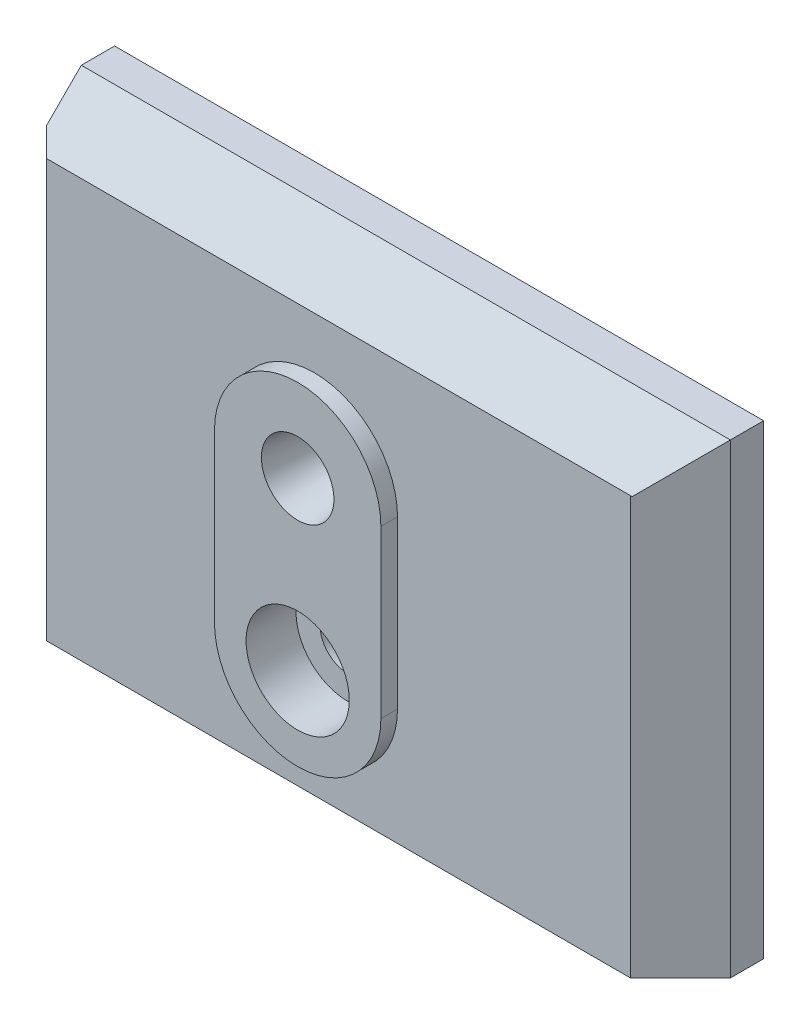
ISO-10303-21;
HEADER;
FILE_DESCRIPTION(('STEP AP214'),'2;1');
FILE_NAME('part.step','',(''),(''),'','','');
FILE_SCHEMA(('AUTOMOTIVE_DESIGN { 1 0 10303 214 1 1 1 1 }'));
ENDSEC;
DATA;
#1=APPLICATION_CONTEXT('core data for automotive mechanical design processes');
#2=APPLICATION_PROTOCOL_DEFINITION('international standard','automotive_design',2000,#1);
#3=PRODUCT_CONTEXT('',#1,'mechanical');
#4=PRODUCT('Part','Part','',(#3));
#5=PRODUCT_RELATED_PRODUCT_CATEGORY('part','',(#4));
#6=PRODUCT_DEFINITION_FORMATION('','',#4);
#7=PRODUCT_DEFINITION_CONTEXT('part definition',#1,'design');
#8=PRODUCT_DEFINITION('design','',#6,#7);
#9=PRODUCT_DEFINITION_SHAPE('','',#8);
#10=(LENGTH_UNIT() NAMED_UNIT(*) SI_UNIT(.MILLI.,.METRE.));
#11=(NAMED_UNIT(*) PLANE_ANGLE_UNIT() SI_UNIT($,.RADIAN.));
#12=(NAMED_UNIT(*) SI_UNIT($,.STERADIAN.) SOLID_ANGLE_UNIT());
#13=UNCERTAINTY_MEASURE_WITH_UNIT(LENGTH_MEASURE(1.E-05),#10,'distance_accuracy_value','');
#14=(GEOMETRIC_REPRESENTATION_CONTEXT(3) GLOBAL_UNCERTAINTY_ASSIGNED_CONTEXT((#13)) GLOBAL_UNIT_ASSIGNED_CONTEXT((#10,
#11,#12)) REPRESENTATION_CONTEXT('',''));
#15=CARTESIAN_POINT('',(0.,0.,0.));
#16=DIRECTION('',(0.,0.,1.));
#17=DIRECTION('',(1.,0.,0.));
#18=AXIS2_PLACEMENT_3D('',#15,#16,#17);
#19=CARTESIAN_POINT('',(0.,-10.,3.));
#20=DIRECTION('',(0.,0.,1.));
#21=DIRECTION('',(1.,0.,0.));
#22=AXIS2_PLACEMENT_3D('',#19,#20,#21);
#23=CYLINDRICAL_SURFACE('',#22,3.1);
#24=CARTESIAN_POINT('',(0.,-10.,3.));
#25=DIRECTION('',(0.,0.,1.));
#26=DIRECTION('',(1.,0.,0.));
#27=AXIS2_PLACEMENT_3D('',#24,#25,#26);
#28=CIRCLE('',#27,3.1);
#29=CARTESIAN_POINT('',(3.1,-10.,3.));
#30=VERTEX_POINT('',#29);
#31=EDGE_CURVE('E189',#30,#30,#28,.T.);
#32=ORIENTED_EDGE('',*,*,#31,.F.);
#33=EDGE_LOOP('',(#32));
#34=FACE_BOUND('',#33,.T.);
#35=CARTESIAN_POINT('',(0.,-10.,6.));
#36=DIRECTION('',(0.,0.,1.));
#37=DIRECTION('',(1.,0.,0.));
#38=AXIS2_PLACEMENT_3D('',#35,#36,#37);
#39=CIRCLE('',#38,3.1);
#40=CARTESIAN_POINT('',(3.1,-10.,6.));
#41=VERTEX_POINT('',#40);
#42=EDGE_CURVE('E19',#41,#41,#39,.F.);
#43=ORIENTED_EDGE('',*,*,#42,.F.);
#44=EDGE_LOOP('',(#43));
#45=FACE_BOUND('',#44,.T.);
#46=ADVANCED_FACE('F16',(#34,#45),#23,.F.);
#47=CARTESIAN_POINT('',(-20.,8.050252531694,4.949747468306));
#48=DIRECTION('',(0.,-0.707106781186548,0.707106781186548));
#49=DIRECTION('',(0.,-0.707106781186548,-0.707106781186548));
#50=AXIS2_PLACEMENT_3D('',#47,#48,#49);
#51=PLANE('',#50);
#52=DIRECTION('',(1.,0.,0.));
#53=VECTOR('',#52,1.);
#54=CARTESIAN_POINT('',(-20.,8.050252531694,4.949747468306));
#55=LINE('',#54,#53);
#56=CARTESIAN_POINT('',(-16.1507575950797,8.050252531694,4.94974746830575));
#57=VERTEX_POINT('',#56);
#58=CARTESIAN_POINT('',(19.050252531694,8.050252531694,4.949747468306));
#59=VERTEX_POINT('',#58);
#60=EDGE_CURVE('E192',#57,#59,#55,.T.);
#61=ORIENTED_EDGE('',*,*,#60,.F.);
#62=DIRECTION('',(0.577350269201096,0.577350269166656,0.577350269201125));
#63=VECTOR('',#62,1.);
#64=CARTESIAN_POINT('',(-16.150757595079,8.05025253169402,4.949747468305));
#65=LINE('',#64,#63);
#66=CARTESIAN_POINT('',(-16.1005050633805,8.10050506338801,5.0000000000005));
#67=VERTEX_POINT('',#66);
#68=EDGE_CURVE('E204',#57,#67,#65,.T.);
#69=ORIENTED_EDGE('',*,*,#68,.T.);
#70=DIRECTION('',(1.,0.,0.));
#71=VECTOR('',#70,1.);
#72=CARTESIAN_POINT('',(-17.,8.100505063388,5.));
#73=LINE('',#72,#71);
#74=CARTESIAN_POINT('',(19.,8.10050506338801,5.));
#75=VERTEX_POINT('',#74);
#76=EDGE_CURVE('E211',#75,#67,#73,.F.);
#77=ORIENTED_EDGE('',*,*,#76,.F.);
#78=DIRECTION('',(-0.577350269189639,0.577350269189619,0.577350269189619));
#79=VECTOR('',#78,1.);
#80=CARTESIAN_POINT('',(19.050252531694,8.050252531694,4.949747468306));
#81=LINE('',#80,#79);
#82=EDGE_CURVE('E168',#59,#75,#81,.T.);
#83=ORIENTED_EDGE('',*,*,#82,.F.);
#84=EDGE_LOOP('',(#61,#69,#77,#83));
#85=FACE_BOUND('',#84,.T.);
#86=ADVANCED_FACE('F354',(#85),#51,.F.);
#87=CARTESIAN_POINT('',(5.,-10.,0.));
#88=DIRECTION('',(1.,0.,0.));
#89=DIRECTION('',(0.,0.,-1.));
#90=AXIS2_PLACEMENT_3D('',#87,#88,#89);
#91=PLANE('',#90);
#92=DIRECTION('',(0.,0.,1.));
#93=VECTOR('',#92,1.);
#94=CARTESIAN_POINT('',(5.,0.,5.));
#95=LINE('',#94,#93);
#96=CARTESIAN_POINT('',(5.,0.,6.));
#97=VERTEX_POINT('',#96);
#98=CARTESIAN_POINT('',(5.,0.,5.));
#99=VERTEX_POINT('',#98);
#100=EDGE_CURVE('E162',#97,#99,#95,.F.);
#101=ORIENTED_EDGE('',*,*,#100,.F.);
#102=DIRECTION('',(0.,1.,0.));
#103=VECTOR('',#102,1.);
#104=CARTESIAN_POINT('',(5.,-10.,6.));
#105=LINE('',#104,#103);
#106=CARTESIAN_POINT('',(5.,-10.,6.));
#107=VERTEX_POINT('',#106);
#108=EDGE_CURVE('E135',#97,#107,#105,.F.);
#109=ORIENTED_EDGE('',*,*,#108,.T.);
#110=DIRECTION('',(0.,0.,1.));
#111=VECTOR('',#110,1.);
#112=CARTESIAN_POINT('',(5.,-10.,5.));
#113=LINE('',#112,#111);
#114=CARTESIAN_POINT('',(5.,-10.,5.));
#115=VERTEX_POINT('',#114);
#116=EDGE_CURVE('E147',#115,#107,#113,.T.);
#117=ORIENTED_EDGE('',*,*,#116,.F.);
#118=DIRECTION('',(0.,1.,0.));
#119=VECTOR('',#118,1.);
#120=CARTESIAN_POINT('',(5.,-17.,5.));
#121=LINE('',#120,#119);
#122=EDGE_CURVE('E188',#99,#115,#121,.F.);
#123=ORIENTED_EDGE('',*,*,#122,.F.);
#124=EDGE_LOOP('',(#101,#109,#117,#123));
#125=FACE_BOUND('',#124,.T.);
#126=ADVANCED_FACE('F365',(#125),#91,.T.);
#127=CARTESIAN_POINT('',(0.,-10.,5.));
#128=DIRECTION('',(0.,0.,1.));
#129=DIRECTION('',(1.,0.,0.));
#130=AXIS2_PLACEMENT_3D('',#127,#128,#129);
#131=CYLINDRICAL_SURFACE('',#130,5.);
#132=CARTESIAN_POINT('',(0.,-10.,6.));
#133=DIRECTION('',(0.,0.,1.));
#134=DIRECTION('',(1.,0.,0.));
#135=AXIS2_PLACEMENT_3D('',#132,#133,#134);
#136=CIRCLE('',#135,5.);
#137=CARTESIAN_POINT('',(-5.,-10.,6.));
#138=VERTEX_POINT('',#137);
#139=EDGE_CURVE('E141',#107,#138,#136,.F.);
#140=ORIENTED_EDGE('',*,*,#139,.T.);
#141=DIRECTION('',(0.,0.,-1.));
#142=VECTOR('',#141,1.);
#143=CARTESIAN_POINT('',(-5.,-10.,0.));
#144=LINE('',#143,#142);
#145=CARTESIAN_POINT('',(-5.,-10.,5.));
#146=VERTEX_POINT('',#145);
#147=EDGE_CURVE('E145',#138,#146,#144,.T.);
#148=ORIENTED_EDGE('',*,*,#147,.T.);
#149=CARTESIAN_POINT('',(0.,-10.,5.));
#150=DIRECTION('',(0.,0.,1.));
#151=DIRECTION('',(1.,0.,0.));
#152=AXIS2_PLACEMENT_3D('',#149,#150,#151);
#153=CIRCLE('',#152,5.);
#154=EDGE_CURVE('E186',#115,#146,#153,.F.);
#155=ORIENTED_EDGE('',*,*,#154,.F.);
#156=ORIENTED_EDGE('',*,*,#116,.T.);
#157=EDGE_LOOP('',(#140,#148,#155,#156));
#158=FACE_BOUND('',#157,.T.);
#159=ADVANCED_FACE('F143',(#158),#131,.T.);
#160=CARTESIAN_POINT('',(-5.,-10.,0.));
#161=DIRECTION('',(1.,0.,0.));
#162=DIRECTION('',(0.,0.,-1.));
#163=AXIS2_PLACEMENT_3D('',#160,#161,#162);
#164=PLANE('',#163);
#165=DIRECTION('',(0.,0.,1.));
#166=VECTOR('',#165,1.);
#167=CARTESIAN_POINT('',(-5.,0.,5.));
#168=LINE('',#167,#166);
#169=CARTESIAN_POINT('',(-5.,0.,5.));
#170=VERTEX_POINT('',#169);
#171=CARTESIAN_POINT('',(-5.,0.,6.));
#172=VERTEX_POINT('',#171);
#173=EDGE_CURVE('E164',#170,#172,#168,.T.);
#174=ORIENTED_EDGE('',*,*,#173,.F.);
#175=DIRECTION('',(0.,1.,0.));
#176=VECTOR('',#175,1.);
#177=CARTESIAN_POINT('',(-5.,-17.,5.));
#178=LINE('',#177,#176);
#179=EDGE_CURVE('E155',#146,#170,#178,.T.);
#180=ORIENTED_EDGE('',*,*,#179,.F.);
#181=ORIENTED_EDGE('',*,*,#147,.F.);
#182=DIRECTION('',(0.,1.,0.));
#183=VECTOR('',#182,1.);
#184=CARTESIAN_POINT('',(-5.,-10.,6.));
#185=LINE('',#184,#183);
#186=EDGE_CURVE('E153',#172,#138,#185,.F.);
#187=ORIENTED_EDGE('',*,*,#186,.F.);
#188=EDGE_LOOP('',(#174,#180,#181,#187));
#189=FACE_BOUND('',#188,.T.);
#190=ADVANCED_FACE('F152',(#189),#164,.F.);
#191=CARTESIAN_POINT('',(0.,0.,5.));
#192=DIRECTION('',(0.,0.,1.));
#193=DIRECTION('',(1.,0.,0.));
#194=AXIS2_PLACEMENT_3D('',#191,#192,#193);
#195=CYLINDRICAL_SURFACE('',#194,5.);
#196=CARTESIAN_POINT('',(0.,0.,5.));
#197=DIRECTION('',(0.,0.,1.));
#198=DIRECTION('',(1.,0.,0.));
#199=AXIS2_PLACEMENT_3D('',#196,#197,#198);
#200=CIRCLE('',#199,5.);
#201=EDGE_CURVE('E182',#170,#99,#200,.F.);
#202=ORIENTED_EDGE('',*,*,#201,.F.);
#203=ORIENTED_EDGE('',*,*,#173,.T.);
#204=CARTESIAN_POINT('',(0.,0.,6.));
#205=DIRECTION('',(0.,0.,1.));
#206=DIRECTION('',(1.,0.,0.));
#207=AXIS2_PLACEMENT_3D('',#204,#205,#206);
#208=CIRCLE('',#207,5.);
#209=EDGE_CURVE('E161',#97,#172,#208,.T.);
#210=ORIENTED_EDGE('',*,*,#209,.F.);
#211=ORIENTED_EDGE('',*,*,#100,.T.);
#212=EDGE_LOOP('',(#202,#203,#210,#211));
#213=FACE_BOUND('',#212,.T.);
#214=ADVANCED_FACE('F432',(#213),#195,.T.);
#215=CARTESIAN_POINT('',(0.,0.,6.));
#216=DIRECTION('',(0.,0.,1.));
#217=DIRECTION('',(1.,0.,0.));
#218=AXIS2_PLACEMENT_3D('',#215,#216,#217);
#219=PLANE('',#218);
#220=ORIENTED_EDGE('',*,*,#186,.T.);
#221=ORIENTED_EDGE('',*,*,#139,.F.);
#222=ORIENTED_EDGE('',*,*,#108,.F.);
#223=ORIENTED_EDGE('',*,*,#209,.T.);
#224=EDGE_LOOP('',(#220,#221,#222,#223));
#225=FACE_BOUND('',#224,.T.);
#226=ORIENTED_EDGE('',*,*,#42,.T.);
#227=EDGE_LOOP('',(#226));
#228=FACE_BOUND('',#227,.T.);
#229=CARTESIAN_POINT('',(0.,0.,6.00000000002865));
#230=DIRECTION('',(0.,0.,1.));
#231=DIRECTION('',(0.,-1.,0.));
#232=AXIS2_PLACEMENT_3D('',#229,#230,#231);
#233=CIRCLE('',#232,2.17999999999734);
#234=CARTESIAN_POINT('',(0.,-2.17999999999734,6.00000000002865));
#235=VERTEX_POINT('',#234);
#236=EDGE_CURVE('E178',#235,#235,#233,.F.);
#237=ORIENTED_EDGE('',*,*,#236,.T.);
#238=EDGE_LOOP('',(#237));
#239=FACE_BOUND('',#238,.T.);
#240=ADVANCED_FACE('F158',(#225,#228,#239),#219,.T.);
#241=CARTESIAN_POINT('',(0.,-10.,3.));
#242=DIRECTION('',(0.,0.,1.));
#243=DIRECTION('',(1.,0.,0.));
#244=AXIS2_PLACEMENT_3D('',#241,#242,#243);
#245=PLANE('',#244);
#246=CARTESIAN_POINT('',(0.,-10.,3.));
#247=DIRECTION('',(0.,0.,1.));
#248=DIRECTION('',(1.,0.,0.));
#249=AXIS2_PLACEMENT_3D('',#246,#247,#248);
#250=CIRCLE('',#249,1.65);
#251=CARTESIAN_POINT('',(1.65,-10.,3.));
#252=VERTEX_POINT('',#251);
#253=EDGE_CURVE('E174',#252,#252,#250,.F.);
#254=ORIENTED_EDGE('',*,*,#253,.T.);
#255=EDGE_LOOP('',(#254));
#256=FACE_BOUND('',#255,.T.);
#257=ORIENTED_EDGE('',*,*,#31,.T.);
#258=EDGE_LOOP('',(#257));
#259=FACE_BOUND('',#258,.T.);
#260=ADVANCED_FACE('F426',(#256,#259),#245,.T.);
#261=CARTESIAN_POINT('',(-20.,13.,0.));
#262=DIRECTION('',(0.,0.707106781186548,0.707106781186548));
#263=DIRECTION('',(0.,-0.707106781186548,0.707106781186548));
#264=AXIS2_PLACEMENT_3D('',#261,#262,#263);
#265=PLANE('',#264);
#266=DIRECTION('',(1.,0.,0.));
#267=VECTOR('',#266,1.);
#268=CARTESIAN_POINT('',(-17.,11.,2.));
#269=LINE('',#268,#267);
#270=CARTESIAN_POINT('',(-17.,11.,2.));
#271=VERTEX_POINT('',#270);
#272=CARTESIAN_POINT('',(22.,11.,2.));
#273=VERTEX_POINT('',#272);
#274=EDGE_CURVE('E177',#271,#273,#269,.T.);
#275=ORIENTED_EDGE('',*,*,#274,.F.);
#276=DIRECTION('',(0.,-0.707106781186548,0.707106781186547));
#277=VECTOR('',#276,1.);
#278=CARTESIAN_POINT('',(-17.,11.,2.));
#279=LINE('',#278,#277);
#280=CARTESIAN_POINT('',(-16.9999999999995,8.899494936612,4.1005050633875));
#281=VERTEX_POINT('',#280);
#282=EDGE_CURVE('E230',#271,#281,#279,.T.);
#283=ORIENTED_EDGE('',*,*,#282,.T.);
#284=DIRECTION('',(0.577350269189854,-0.57735026918917,0.577350269189853));
#285=VECTOR('',#284,1.);
#286=CARTESIAN_POINT('',(-16.999999999998,8.89949493661201,4.100505063386));
#287=LINE('',#286,#285);
#288=EDGE_CURVE('E201',#281,#57,#287,.T.);
#289=ORIENTED_EDGE('',*,*,#288,.T.);
#290=ORIENTED_EDGE('',*,*,#60,.T.);
#291=DIRECTION('',(-0.577350269189626,-0.577350269189625,0.577350269189626));
#292=VECTOR('',#291,1.);
#293=CARTESIAN_POINT('',(22.,11.,2.));
#294=LINE('',#293,#292);
#295=EDGE_CURVE('E181',#273,#59,#294,.T.);
#296=ORIENTED_EDGE('',*,*,#295,.F.);
#297=EDGE_LOOP('',(#275,#283,#289,#290,#296));
#298=FACE_BOUND('',#297,.T.);
#299=ADVANCED_FACE('F342',(#298),#265,.T.);
#300=CARTESIAN_POINT('',(-20.05025253169,-18.,1.050252531694));
#301=DIRECTION('',(0.707106781186548,0.,-0.707106781186548));
#302=DIRECTION('',(-0.707106781186548,0.,-0.707106781186548));
#303=AXIS2_PLACEMENT_3D('',#300,#301,#302);
#304=PLANE('',#303);
#305=ORIENTED_EDGE('',*,*,#288,.F.);
#306=DIRECTION('',(0.,1.,0.));
#307=VECTOR('',#306,1.);
#308=CARTESIAN_POINT('',(-17.,-17.,4.100505063388));
#309=LINE('',#308,#307);
#310=CARTESIAN_POINT('',(-16.999999999999,-17.,4.100505063387));
#311=VERTEX_POINT('',#310);
#312=EDGE_CURVE('E233',#281,#311,#309,.F.);
#313=ORIENTED_EDGE('',*,*,#312,.T.);
#314=DIRECTION('',(-0.707106781186548,0.,-0.707106781186548));
#315=VECTOR('',#314,1.);
#316=CARTESIAN_POINT('',(-20.05025253169,-17.,1.050252531694));
#317=LINE('',#316,#315);
#318=CARTESIAN_POINT('',(-16.100505063381,-17.,5.000000000001));
#319=VERTEX_POINT('',#318);
#320=EDGE_CURVE('E199',#319,#311,#317,.T.);
#321=ORIENTED_EDGE('',*,*,#320,.F.);
#322=DIRECTION('',(0.,1.,0.));
#323=VECTOR('',#322,1.);
#324=CARTESIAN_POINT('',(-16.10050506338,-17.,5.));
#325=LINE('',#324,#323);
#326=EDGE_CURVE('E213',#67,#319,#325,.F.);
#327=ORIENTED_EDGE('',*,*,#326,.F.);
#328=ORIENTED_EDGE('',*,*,#68,.F.);
#329=EDGE_LOOP('',(#305,#313,#321,#327,#328));
#330=FACE_BOUND('',#329,.T.);
#331=ADVANCED_FACE('F352',(#330),#304,.F.);
#332=CARTESIAN_POINT('',(15.,-18.,3.5));
#333=DIRECTION('',(0.707106781186548,0.,0.707106781186548));
#334=DIRECTION('',(0.707106781186548,0.,-0.707106781186548));
#335=AXIS2_PLACEMENT_3D('',#332,#333,#334);
#336=PLANE('',#335);
#337=DIRECTION('',(-0.707106781186548,0.,0.707106781186547));
#338=VECTOR('',#337,1.);
#339=CARTESIAN_POINT('',(17.5,-17.,1.));
#340=LINE('',#339,#338);
#341=CARTESIAN_POINT('',(17.5,-17.,1.));
#342=VERTEX_POINT('',#341);
#343=CARTESIAN_POINT('',(15.5,-17.,3.));
#344=VERTEX_POINT('',#343);
#345=EDGE_CURVE('E258',#342,#344,#340,.T.);
#346=ORIENTED_EDGE('',*,*,#345,.T.);
#347=DIRECTION('',(0.,1.,0.));
#348=VECTOR('',#347,1.);
#349=CARTESIAN_POINT('',(15.5,-18.,3.));
#350=LINE('',#349,#348);
#351=CARTESIAN_POINT('',(15.5,5.,3.));
#352=VERTEX_POINT('',#351);
#353=EDGE_CURVE('E207',#344,#352,#350,.T.);
#354=ORIENTED_EDGE('',*,*,#353,.T.);
#355=DIRECTION('',(0.707106781186548,0.,-0.707106781186547));
#356=VECTOR('',#355,1.);
#357=CARTESIAN_POINT('',(15.5,5.,3.));
#358=LINE('',#357,#356);
#359=CARTESIAN_POINT('',(17.5,5.00000000000001,0.999999999999999));
#360=VERTEX_POINT('',#359);
#361=EDGE_CURVE('E247',#352,#360,#358,.T.);
#362=ORIENTED_EDGE('',*,*,#361,.T.);
#363=DIRECTION('',(0.,1.,0.));
#364=VECTOR('',#363,1.);
#365=CARTESIAN_POINT('',(17.5,-18.,1.));
#366=LINE('',#365,#364);
#367=EDGE_CURVE('E250',#360,#342,#366,.F.);
#368=ORIENTED_EDGE('',*,*,#367,.T.);
#369=EDGE_LOOP('',(#346,#354,#362,#368));
#370=FACE_BOUND('',#369,.T.);
#371=ADVANCED_FACE('F417',(#370),#336,.F.);
#372=CARTESIAN_POINT('',(7.5,-18.,3.));
#373=DIRECTION('',(0.,0.,1.));
#374=DIRECTION('',(1.,0.,0.));
#375=AXIS2_PLACEMENT_3D('',#372,#373,#374);
#376=PLANE('',#375);
#377=DIRECTION('',(1.,0.,0.));
#378=VECTOR('',#377,1.);
#379=CARTESIAN_POINT('',(-17.,-17.,3.));
#380=LINE('',#379,#378);
#381=CARTESIAN_POINT('',(9.57106781186509,-17.,2.99999999999991));
#382=VERTEX_POINT('',#381);
#383=EDGE_CURVE('E261',#344,#382,#380,.F.);
#384=ORIENTED_EDGE('',*,*,#383,.T.);
#385=DIRECTION('',(0.,1.,0.));
#386=VECTOR('',#385,1.);
#387=CARTESIAN_POINT('',(9.57106781186537,-18.,2.99999999999963));
#388=LINE('',#387,#386);
#389=CARTESIAN_POINT('',(9.57106781186519,5.00000000000001,2.99999999999982));
#390=VERTEX_POINT('',#389);
#391=EDGE_CURVE('E209',#390,#382,#388,.F.);
#392=ORIENTED_EDGE('',*,*,#391,.F.);
#393=DIRECTION('',(1.,0.,0.));
#394=VECTOR('',#393,1.);
#395=CARTESIAN_POINT('',(7.5,5.,3.));
#396=LINE('',#395,#394);
#397=EDGE_CURVE('E244',#390,#352,#396,.T.);
#398=ORIENTED_EDGE('',*,*,#397,.T.);
#399=ORIENTED_EDGE('',*,*,#353,.F.);
#400=EDGE_LOOP('',(#384,#392,#398,#399));
#401=FACE_BOUND('',#400,.T.);
#402=ADVANCED_FACE('F413',(#401),#376,.F.);
#403=CARTESIAN_POINT('',(6.535533905933,-18.,-0.03553390593274));
#404=DIRECTION('',(0.707106781186548,0.,-0.707106781186548));
#405=DIRECTION('',(-0.707106781186548,0.,-0.707106781186548));
#406=AXIS2_PLACEMENT_3D('',#403,#404,#405);
#407=PLANE('',#406);
#408=DIRECTION('',(0.707106781186547,0.,0.707106781186547));
#409=VECTOR('',#408,1.);
#410=CARTESIAN_POINT('',(7.5,5.,0.928932188135));
#411=LINE('',#410,#409);
#412=CARTESIAN_POINT('',(7.50000000000009,5.,0.928932188134908));
#413=VERTEX_POINT('',#412);
#414=EDGE_CURVE('E241',#413,#390,#411,.T.);
#415=ORIENTED_EDGE('',*,*,#414,.T.);
#416=ORIENTED_EDGE('',*,*,#391,.T.);
#417=DIRECTION('',(-0.707106781186548,0.,-0.707106781186547));
#418=VECTOR('',#417,1.);
#419=CARTESIAN_POINT('',(9.571067811865,-17.,3.));
#420=LINE('',#419,#418);
#421=CARTESIAN_POINT('',(7.50000000000019,-17.,0.928932188134815));
#422=VERTEX_POINT('',#421);
#423=EDGE_CURVE('E264',#382,#422,#420,.T.);
#424=ORIENTED_EDGE('',*,*,#423,.T.);
#425=DIRECTION('',(0.,1.,0.));
#426=VECTOR('',#425,1.);
#427=CARTESIAN_POINT('',(7.5,-18.,0.928932188135));
#428=LINE('',#427,#426);
#429=EDGE_CURVE('E236',#413,#422,#428,.F.);
#430=ORIENTED_EDGE('',*,*,#429,.F.);
#431=EDGE_LOOP('',(#415,#416,#424,#430));
#432=FACE_BOUND('',#431,.T.);
#433=ADVANCED_FACE('F409',(#432),#407,.T.);
#434=CARTESIAN_POINT('',(-17.,-17.,5.));
#435=DIRECTION('',(0.,0.,1.));
#436=DIRECTION('',(1.,0.,0.));
#437=AXIS2_PLACEMENT_3D('',#434,#435,#436);
#438=PLANE('',#437);
#439=ORIENTED_EDGE('',*,*,#179,.T.);
#440=ORIENTED_EDGE('',*,*,#201,.T.);
#441=ORIENTED_EDGE('',*,*,#122,.T.);
#442=ORIENTED_EDGE('',*,*,#154,.T.);
#443=EDGE_LOOP('',(#439,#440,#441,#442));
#444=FACE_BOUND('',#443,.T.);
#445=DIRECTION('',(1.,0.,0.));
#446=VECTOR('',#445,1.);
#447=CARTESIAN_POINT('',(-17.,-17.,5.));
#448=LINE('',#447,#446);
#449=CARTESIAN_POINT('',(19.,-17.,5.));
#450=VERTEX_POINT('',#449);
#451=EDGE_CURVE('E272',#319,#450,#448,.T.);
#452=ORIENTED_EDGE('',*,*,#451,.T.);
#453=DIRECTION('',(0.,1.,0.));
#454=VECTOR('',#453,1.);
#455=CARTESIAN_POINT('',(19.,-18.,5.));
#456=LINE('',#455,#454);
#457=EDGE_CURVE('E185',#75,#450,#456,.F.);
#458=ORIENTED_EDGE('',*,*,#457,.F.);
#459=ORIENTED_EDGE('',*,*,#76,.T.);
#460=ORIENTED_EDGE('',*,*,#326,.T.);
#461=EDGE_LOOP('',(#452,#458,#459,#460));
#462=FACE_BOUND('',#461,.T.);
#463=ADVANCED_FACE('F348',(#444,#462),#438,.T.);
#464=CARTESIAN_POINT('',(18.,-18.,6.));
#465=DIRECTION('',(0.707106781186548,0.,0.707106781186548));
#466=DIRECTION('',(0.707106781186548,0.,-0.707106781186548));
#467=AXIS2_PLACEMENT_3D('',#464,#465,#466);
#468=PLANE('',#467);
#469=ORIENTED_EDGE('',*,*,#295,.T.);
#470=ORIENTED_EDGE('',*,*,#82,.T.);
#471=ORIENTED_EDGE('',*,*,#457,.T.);
#472=DIRECTION('',(0.707106781186547,0.,-0.707106781186548));
#473=VECTOR('',#472,1.);
#474=CARTESIAN_POINT('',(19.,-17.,5.));
#475=LINE('',#474,#473);
#476=CARTESIAN_POINT('',(22.,-17.,2.));
#477=VERTEX_POINT('',#476);
#478=EDGE_CURVE('E275',#450,#477,#475,.T.);
#479=ORIENTED_EDGE('',*,*,#478,.T.);
#480=DIRECTION('',(0.,1.,0.));
#481=VECTOR('',#480,1.);
#482=CARTESIAN_POINT('',(22.,-17.,2.));
#483=LINE('',#482,#481);
#484=EDGE_CURVE('E278',#273,#477,#483,.F.);
#485=ORIENTED_EDGE('',*,*,#484,.F.);
#486=EDGE_LOOP('',(#469,#470,#471,#479,#485));
#487=FACE_BOUND('',#486,.T.);
#488=ADVANCED_FACE('F344',(#487),#468,.T.);
#489=CARTESIAN_POINT('',(0.,0.,5.99999999991496));
#490=DIRECTION('',(0.,0.,1.));
#491=DIRECTION('',(0.,-1.,0.));
#492=AXIS2_PLACEMENT_3D('',#489,#490,#491);
#493=CONICAL_SURFACE('',#492,2.17999999998142,0.139095941481144);
#494=ORIENTED_EDGE('',*,*,#236,.F.);
#495=EDGE_LOOP('',(#494));
#496=FACE_BOUND('',#495,.T.);
#497=CARTESIAN_POINT('',(0.,0.,1.19230769229262));
#498=DIRECTION('',(0.,0.,-1.));
#499=DIRECTION('',(1.,0.,0.));
#500=AXIS2_PLACEMENT_3D('',#497,#498,#499);
#501=CIRCLE('',#500,1.50692307693134);
#502=CARTESIAN_POINT('',(1.50692307693134,0.,1.19230769229262));
#503=VERTEX_POINT('',#502);
#504=EDGE_CURVE('E225',#503,#503,#501,.T.);
#505=ORIENTED_EDGE('',*,*,#504,.T.);
#506=EDGE_LOOP('',(#505));
#507=FACE_BOUND('',#506,.T.);
#508=ADVANCED_FACE('F400',(#496,#507),#493,.F.);
#509=CARTESIAN_POINT('',(0.,-10.,-1.));
#510=DIRECTION('',(0.,0.,1.));
#511=DIRECTION('',(1.,0.,0.));
#512=AXIS2_PLACEMENT_3D('',#509,#510,#511);
#513=CYLINDRICAL_SURFACE('',#512,1.65);
#514=ORIENTED_EDGE('',*,*,#253,.F.);
#515=EDGE_LOOP('',(#514));
#516=FACE_BOUND('',#515,.T.);
#517=CARTESIAN_POINT('',(0.,-10.,0.499999999988177));
#518=DIRECTION('',(0.,0.,-1.));
#519=DIRECTION('',(1.,0.,0.));
#520=AXIS2_PLACEMENT_3D('',#517,#518,#519);
#521=CIRCLE('',#520,1.64999999998372);
#522=CARTESIAN_POINT('',(1.64999999998372,-10.,0.499999999988177));
#523=VERTEX_POINT('',#522);
#524=EDGE_CURVE('E221',#523,#523,#521,.T.);
#525=ORIENTED_EDGE('',*,*,#524,.T.);
#526=EDGE_LOOP('',(#525));
#527=FACE_BOUND('',#526,.T.);
#528=ADVANCED_FACE('F397',(#516,#527),#513,.F.);
#529=CARTESIAN_POINT('',(-17.,11.,0.));
#530=DIRECTION('',(0.,1.,0.));
#531=DIRECTION('',(0.,0.,1.));
#532=AXIS2_PLACEMENT_3D('',#529,#530,#531);
#533=PLANE('',#532);
#534=DIRECTION('',(0.,0.,-1.));
#535=VECTOR('',#534,1.);
#536=CARTESIAN_POINT('',(-17.,11.,0.));
#537=LINE('',#536,#535);
#538=CARTESIAN_POINT('',(-17.,11.,0.));
#539=VERTEX_POINT('',#538);
#540=EDGE_CURVE('E227',#539,#271,#537,.F.);
#541=ORIENTED_EDGE('',*,*,#540,.T.);
#542=ORIENTED_EDGE('',*,*,#274,.T.);
#543=DIRECTION('',(0.,0.,-1.));
#544=VECTOR('',#543,1.);
#545=CARTESIAN_POINT('',(22.,11.,0.));
#546=LINE('',#545,#544);
#547=CARTESIAN_POINT('',(22.,11.,0.));
#548=VERTEX_POINT('',#547);
#549=EDGE_CURVE('E281',#548,#273,#546,.F.);
#550=ORIENTED_EDGE('',*,*,#549,.F.);
#551=DIRECTION('',(1.,0.,0.));
#552=VECTOR('',#551,1.);
#553=CARTESIAN_POINT('',(-17.,11.,0.));
#554=LINE('',#553,#552);
#555=EDGE_CURVE('E224',#548,#539,#554,.F.);
#556=ORIENTED_EDGE('',*,*,#555,.T.);
#557=EDGE_LOOP('',(#541,#542,#550,#556));
#558=FACE_BOUND('',#557,.T.);
#559=ADVANCED_FACE('F339',(#558),#533,.T.);
#560=CARTESIAN_POINT('',(-17.,-17.,0.));
#561=DIRECTION('',(1.,0.,0.));
#562=DIRECTION('',(0.,0.,-1.));
#563=AXIS2_PLACEMENT_3D('',#560,#561,#562);
#564=PLANE('',#563);
#565=ORIENTED_EDGE('',*,*,#282,.F.);
#566=ORIENTED_EDGE('',*,*,#540,.F.);
#567=DIRECTION('',(0.,1.,0.));
#568=VECTOR('',#567,1.);
#569=CARTESIAN_POINT('',(-17.,-17.,0.));
#570=LINE('',#569,#568);
#571=CARTESIAN_POINT('',(-17.,-17.,0.));
#572=VERTEX_POINT('',#571);
#573=EDGE_CURVE('E288',#539,#572,#570,.F.);
#574=ORIENTED_EDGE('',*,*,#573,.T.);
#575=DIRECTION('',(0.,0.,1.));
#576=VECTOR('',#575,1.);
#577=CARTESIAN_POINT('',(-17.,-17.,0.));
#578=LINE('',#577,#576);
#579=EDGE_CURVE('E269',#572,#311,#578,.T.);
#580=ORIENTED_EDGE('',*,*,#579,.T.);
#581=ORIENTED_EDGE('',*,*,#312,.F.);
#582=EDGE_LOOP('',(#565,#566,#574,#580,#581));
#583=FACE_BOUND('',#582,.T.);
#584=ADVANCED_FACE('F337',(#583),#564,.F.);
#585=CARTESIAN_POINT('',(7.5,-18.,-1.));
#586=DIRECTION('',(1.,0.,0.));
#587=DIRECTION('',(0.,0.,-1.));
#588=AXIS2_PLACEMENT_3D('',#585,#586,#587);
#589=PLANE('',#588);
#590=DIRECTION('',(0.,1.,0.));
#591=VECTOR('',#590,1.);
#592=CARTESIAN_POINT('',(7.5,-17.,0.));
#593=LINE('',#592,#591);
#594=CARTESIAN_POINT('',(7.5,-17.,0.));
#595=VERTEX_POINT('',#594);
#596=CARTESIAN_POINT('',(7.5,5.,0.));
#597=VERTEX_POINT('',#596);
#598=EDGE_CURVE('E294',#595,#597,#593,.T.);
#599=ORIENTED_EDGE('',*,*,#598,.T.);
#600=DIRECTION('',(0.,0.,1.));
#601=VECTOR('',#600,1.);
#602=CARTESIAN_POINT('',(7.5,5.,-1.));
#603=LINE('',#602,#601);
#604=EDGE_CURVE('E238',#597,#413,#603,.T.);
#605=ORIENTED_EDGE('',*,*,#604,.T.);
#606=ORIENTED_EDGE('',*,*,#429,.T.);
#607=DIRECTION('',(0.,0.,1.));
#608=VECTOR('',#607,1.);
#609=CARTESIAN_POINT('',(7.5,-17.,0.));
#610=LINE('',#609,#608);
#611=EDGE_CURVE('E267',#422,#595,#610,.F.);
#612=ORIENTED_EDGE('',*,*,#611,.T.);
#613=EDGE_LOOP('',(#599,#605,#606,#612));
#614=FACE_BOUND('',#613,.T.);
#615=ADVANCED_FACE('F330',(#614),#589,.T.);
#616=CARTESIAN_POINT('',(7.5,5.,-1.));
#617=DIRECTION('',(0.,1.,0.));
#618=DIRECTION('',(0.,0.,1.));
#619=AXIS2_PLACEMENT_3D('',#616,#617,#618);
#620=PLANE('',#619);
#621=ORIENTED_EDGE('',*,*,#397,.F.);
#622=ORIENTED_EDGE('',*,*,#414,.F.);
#623=ORIENTED_EDGE('',*,*,#604,.F.);
#624=DIRECTION('',(1.,0.,0.));
#625=VECTOR('',#624,1.);
#626=CARTESIAN_POINT('',(-17.,5.,0.));
#627=LINE('',#626,#625);
#628=CARTESIAN_POINT('',(17.5,5.,0.));
#629=VERTEX_POINT('',#628);
#630=EDGE_CURVE('E297',#597,#629,#627,.T.);
#631=ORIENTED_EDGE('',*,*,#630,.T.);
#632=DIRECTION('',(0.,0.,-1.));
#633=VECTOR('',#632,1.);
#634=CARTESIAN_POINT('',(17.5,5.,-1.));
#635=LINE('',#634,#633);
#636=EDGE_CURVE('E252',#629,#360,#635,.F.);
#637=ORIENTED_EDGE('',*,*,#636,.T.);
#638=ORIENTED_EDGE('',*,*,#361,.F.);
#639=EDGE_LOOP('',(#621,#622,#623,#631,#637,#638));
#640=FACE_BOUND('',#639,.T.);
#641=ADVANCED_FACE('F326',(#640),#620,.F.);
#642=CARTESIAN_POINT('',(17.5,-18.,-1.));
#643=DIRECTION('',(1.,0.,0.));
#644=DIRECTION('',(0.,0.,-1.));
#645=AXIS2_PLACEMENT_3D('',#642,#643,#644);
#646=PLANE('',#645);
#647=DIRECTION('',(0.,1.,0.));
#648=VECTOR('',#647,1.);
#649=CARTESIAN_POINT('',(17.5,-17.,0.));
#650=LINE('',#649,#648);
#651=CARTESIAN_POINT('',(17.5,-17.,0.));
#652=VERTEX_POINT('',#651);
#653=EDGE_CURVE('E300',#629,#652,#650,.F.);
#654=ORIENTED_EDGE('',*,*,#653,.T.);
#655=DIRECTION('',(0.,0.,1.));
#656=VECTOR('',#655,1.);
#657=CARTESIAN_POINT('',(17.5,-17.,0.));
#658=LINE('',#657,#656);
#659=EDGE_CURVE('E255',#652,#342,#658,.T.);
#660=ORIENTED_EDGE('',*,*,#659,.T.);
#661=ORIENTED_EDGE('',*,*,#367,.F.);
#662=ORIENTED_EDGE('',*,*,#636,.F.);
#663=EDGE_LOOP('',(#654,#660,#661,#662));
#664=FACE_BOUND('',#663,.T.);
#665=ADVANCED_FACE('F321',(#664),#646,.F.);
#666=CARTESIAN_POINT('',(-17.,-17.,0.));
#667=DIRECTION('',(0.,1.,0.));
#668=DIRECTION('',(0.,0.,1.));
#669=AXIS2_PLACEMENT_3D('',#666,#667,#668);
#670=PLANE('',#669);
#671=ORIENTED_EDGE('',*,*,#451,.F.);
#672=ORIENTED_EDGE('',*,*,#320,.T.);
#673=ORIENTED_EDGE('',*,*,#579,.F.);
#674=DIRECTION('',(1.,0.,0.));
#675=VECTOR('',#674,1.);
#676=CARTESIAN_POINT('',(-17.,-17.,0.));
#677=LINE('',#676,#675);
#678=EDGE_CURVE('E291',#572,#595,#677,.T.);
#679=ORIENTED_EDGE('',*,*,#678,.T.);
#680=ORIENTED_EDGE('',*,*,#611,.F.);
#681=ORIENTED_EDGE('',*,*,#423,.F.);
#682=ORIENTED_EDGE('',*,*,#383,.F.);
#683=ORIENTED_EDGE('',*,*,#345,.F.);
#684=ORIENTED_EDGE('',*,*,#659,.F.);
#685=DIRECTION('',(1.,0.,0.));
#686=VECTOR('',#685,1.);
#687=CARTESIAN_POINT('',(-17.,-17.,0.));
#688=LINE('',#687,#686);
#689=CARTESIAN_POINT('',(22.,-17.,0.));
#690=VERTEX_POINT('',#689);
#691=EDGE_CURVE('E303',#652,#690,#688,.T.);
#692=ORIENTED_EDGE('',*,*,#691,.T.);
#693=DIRECTION('',(0.,0.,-1.));
#694=VECTOR('',#693,1.);
#695=CARTESIAN_POINT('',(22.,-17.,0.));
#696=LINE('',#695,#694);
#697=EDGE_CURVE('E34',#477,#690,#696,.T.);
#698=ORIENTED_EDGE('',*,*,#697,.F.);
#699=ORIENTED_EDGE('',*,*,#478,.F.);
#700=EDGE_LOOP('',(#671,#672,#673,#679,#680,#681,#682,#683,#684,#692,#698,#699));
#701=FACE_BOUND('',#700,.T.);
#702=ADVANCED_FACE('F316',(#701),#670,.F.);
#703=CARTESIAN_POINT('',(22.,-17.,0.));
#704=DIRECTION('',(1.,0.,0.));
#705=DIRECTION('',(0.,0.,-1.));
#706=AXIS2_PLACEMENT_3D('',#703,#704,#705);
#707=PLANE('',#706);
#708=DIRECTION('',(0.,1.,0.));
#709=VECTOR('',#708,1.);
#710=CARTESIAN_POINT('',(22.,-17.,0.));
#711=LINE('',#710,#709);
#712=EDGE_CURVE('E173',#690,#548,#711,.T.);
#713=ORIENTED_EDGE('',*,*,#712,.T.);
#714=ORIENTED_EDGE('',*,*,#549,.T.);
#715=ORIENTED_EDGE('',*,*,#484,.T.);
#716=ORIENTED_EDGE('',*,*,#697,.T.);
#717=EDGE_LOOP('',(#713,#714,#715,#716));
#718=FACE_BOUND('',#717,.T.);
#719=ADVANCED_FACE('F306',(#718),#707,.T.);
#720=CARTESIAN_POINT('',(0.,0.,2.8421709430404E-10));
#721=DIRECTION('',(0.,0.,-1.));
#722=DIRECTION('',(-1.,0.,0.));
#723=AXIS2_PLACEMENT_3D('',#720,#721,#722);
#724=CONICAL_SURFACE('',#723,1.95999999991159,0.363147009973672);
#725=CARTESIAN_POINT('',(0.,0.,5.6843418860808E-11));
#726=DIRECTION('',(0.,0.,-1.));
#727=DIRECTION('',(-1.,0.,0.));
#728=AXIS2_PLACEMENT_3D('',#725,#726,#727);
#729=CIRCLE('',#728,1.95999999999799);
#730=CARTESIAN_POINT('',(-1.95999999999799,0.,5.6843418860808E-11));
#731=VERTEX_POINT('',#730);
#732=EDGE_CURVE('E25',#731,#731,#729,.T.);
#733=ORIENTED_EDGE('',*,*,#732,.T.);
#734=EDGE_LOOP('',(#733));
#735=FACE_BOUND('',#734,.T.);
#736=ORIENTED_EDGE('',*,*,#504,.F.);
#737=EDGE_LOOP('',(#736));
#738=FACE_BOUND('',#737,.T.);
#739=ADVANCED_FACE('F374',(#735,#738),#724,.F.);
#740=CARTESIAN_POINT('',(0.,-10.,0.));
#741=DIRECTION('',(0.,0.,-1.));
#742=DIRECTION('',(-1.,0.,0.));
#743=AXIS2_PLACEMENT_3D('',#740,#741,#742);
#744=CONICAL_SURFACE('',#743,1.98749999998427,0.593749666722486);
#745=ORIENTED_EDGE('',*,*,#524,.F.);
#746=EDGE_LOOP('',(#745));
#747=FACE_BOUND('',#746,.T.);
#748=CARTESIAN_POINT('',(0.,-10.,0.));
#749=DIRECTION('',(0.,0.,-1.));
#750=DIRECTION('',(-1.,0.,0.));
#751=AXIS2_PLACEMENT_3D('',#748,#749,#750);
#752=CIRCLE('',#751,1.98749999998427);
#753=CARTESIAN_POINT('',(-1.98749999998427,-10.,0.));
#754=VERTEX_POINT('',#753);
#755=EDGE_CURVE('E11',#754,#754,#752,.T.);
#756=ORIENTED_EDGE('',*,*,#755,.T.);
#757=EDGE_LOOP('',(#756));
#758=FACE_BOUND('',#757,.T.);
#759=ADVANCED_FACE('F368',(#747,#758),#744,.F.);
#760=CARTESIAN_POINT('',(-17.,-17.,0.));
#761=DIRECTION('',(0.,0.,1.));
#762=DIRECTION('',(1.,0.,0.));
#763=AXIS2_PLACEMENT_3D('',#760,#761,#762);
#764=PLANE('',#763);
#765=ORIENTED_EDGE('',*,*,#755,.F.);
#766=EDGE_LOOP('',(#765));
#767=FACE_BOUND('',#766,.T.);
#768=ORIENTED_EDGE('',*,*,#732,.F.);
#769=EDGE_LOOP('',(#768));
#770=FACE_BOUND('',#769,.T.);
#771=ORIENTED_EDGE('',*,*,#691,.F.);
#772=ORIENTED_EDGE('',*,*,#653,.F.);
#773=ORIENTED_EDGE('',*,*,#630,.F.);
#774=ORIENTED_EDGE('',*,*,#598,.F.);
#775=ORIENTED_EDGE('',*,*,#678,.F.);
#776=ORIENTED_EDGE('',*,*,#573,.F.);
#777=ORIENTED_EDGE('',*,*,#555,.F.);
#778=ORIENTED_EDGE('',*,*,#712,.F.);
#779=EDGE_LOOP('',(#771,#772,#773,#774,#775,#776,#777,#778));
#780=FACE_BOUND('',#779,.T.);
#781=ADVANCED_FACE('F311',(#767,#770,#780),#764,.F.);
#782=CLOSED_SHELL('',(#46,#86,#126,#159,#190,#214,#240,#260,#299,#331,#371,#402,#433,#463,#488,
#508,#528,#559,#584,#615,#641,#665,#702,#719,#739,#759,#781));
#783=MANIFOLD_SOLID_BREP('B1',#782);
#784=ADVANCED_BREP_SHAPE_REPRESENTATION('',(#18,#783),#14);
#785=SHAPE_DEFINITION_REPRESENTATION(#9,#784);
ENDSEC;
END-ISO-10303-21;
